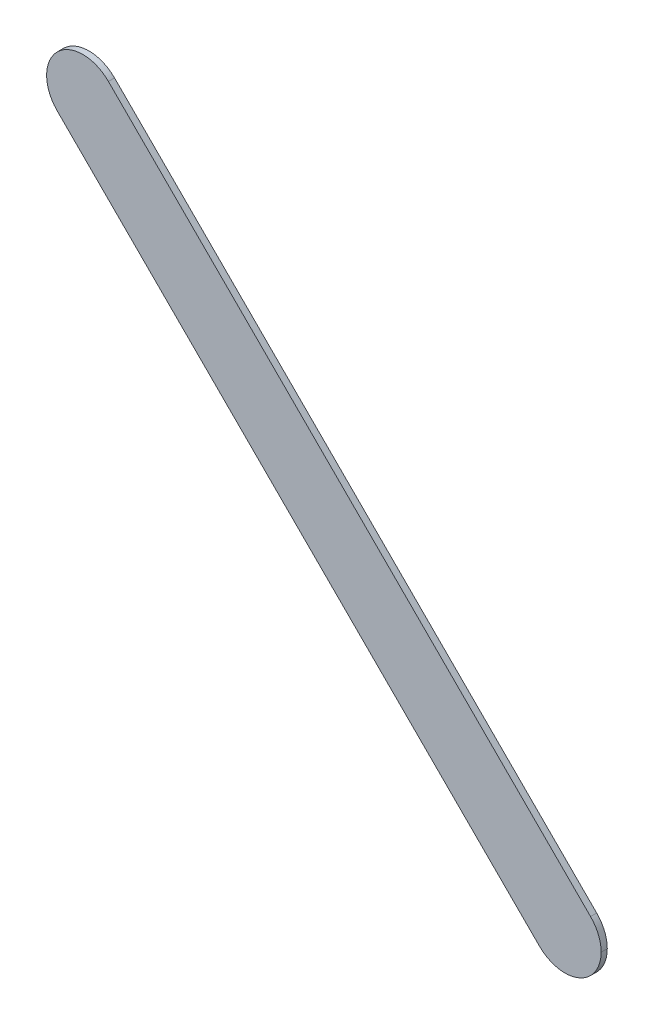
ISO-10303-21;
HEADER;
FILE_DESCRIPTION(('STEP AP214'),'2;1');
FILE_NAME('part.step','',(''),(''),'','','');
FILE_SCHEMA(('AUTOMOTIVE_DESIGN { 1 0 10303 214 1 1 1 1 }'));
ENDSEC;
DATA;
#1=APPLICATION_CONTEXT('core data for automotive mechanical design processes');
#2=APPLICATION_PROTOCOL_DEFINITION('international standard','automotive_design',2000,#1);
#3=PRODUCT_CONTEXT('',#1,'mechanical');
#4=PRODUCT('Part','Part','',(#3));
#5=PRODUCT_RELATED_PRODUCT_CATEGORY('part','',(#4));
#6=PRODUCT_DEFINITION_FORMATION('','',#4);
#7=PRODUCT_DEFINITION_CONTEXT('part definition',#1,'design');
#8=PRODUCT_DEFINITION('design','',#6,#7);
#9=PRODUCT_DEFINITION_SHAPE('','',#8);
#10=(LENGTH_UNIT() NAMED_UNIT(*) SI_UNIT(.MILLI.,.METRE.));
#11=(NAMED_UNIT(*) PLANE_ANGLE_UNIT() SI_UNIT($,.RADIAN.));
#12=(NAMED_UNIT(*) SI_UNIT($,.STERADIAN.) SOLID_ANGLE_UNIT());
#13=UNCERTAINTY_MEASURE_WITH_UNIT(LENGTH_MEASURE(1.E-05),#10,'distance_accuracy_value','');
#14=(GEOMETRIC_REPRESENTATION_CONTEXT(3) GLOBAL_UNCERTAINTY_ASSIGNED_CONTEXT((#13)) GLOBAL_UNIT_ASSIGNED_CONTEXT((#10,
#11,#12)) REPRESENTATION_CONTEXT('',''));
#15=CARTESIAN_POINT('',(0.,0.,0.));
#16=DIRECTION('',(0.,0.,1.));
#17=DIRECTION('',(1.,0.,0.));
#18=AXIS2_PLACEMENT_3D('',#15,#16,#17);
#19=CARTESIAN_POINT('',(20.874999462994,43.162497787694,1.1723000001));
#20=DIRECTION('',(0.,0.,1.));
#21=DIRECTION('',(1.,0.,0.));
#22=AXIS2_PLACEMENT_3D('',#19,#20,#21);
#23=PLANE('',#22);
#24=CARTESIAN_POINT('',(21.375,42.662497558594,1.1723000001));
#25=DIRECTION('',(0.,0.,-1.));
#26=DIRECTION('',(1.,0.,0.));
#27=AXIS2_PLACEMENT_3D('',#24,#25,#26);
#28=CIRCLE('',#27,0.07500062040232);
#29=CARTESIAN_POINT('',(21.428032836914,42.715531616211,1.1723000001));
#30=VERTEX_POINT('',#29);
#31=CARTESIAN_POINT('',(21.450000620402,42.662497558594,1.1723000001));
#32=VERTEX_POINT('',#31);
#33=EDGE_CURVE('E28',#30,#32,#28,.T.);
#34=ORIENTED_EDGE('',*,*,#33,.F.);
#35=DIRECTION('',(-0.707106781186548,0.707106781186548,0.));
#36=VECTOR('',#35,1.);
#37=CARTESIAN_POINT('',(20.428032226563,43.715532226562,1.1723000001));
#38=LINE('',#37,#36);
#39=CARTESIAN_POINT('',(20.428032684326,43.715531768799,1.1723000001));
#40=VERTEX_POINT('',#39);
#41=EDGE_CURVE('E114',#30,#40,#38,.T.);
#42=ORIENTED_EDGE('',*,*,#41,.T.);
#43=CARTESIAN_POINT('',(20.374999389648,43.662497558594,1.1723000001));
#44=DIRECTION('',(0.,0.,1.));
#45=DIRECTION('',(1.,0.,0.));
#46=AXIS2_PLACEMENT_3D('',#43,#44,#45);
#47=CIRCLE('',#46,0.07500105197735);
#48=CARTESIAN_POINT('',(20.321966111155,43.609463332204,1.1723000001));
#49=VERTEX_POINT('',#48);
#50=EDGE_CURVE('E79',#40,#49,#47,.T.);
#51=ORIENTED_EDGE('',*,*,#50,.T.);
#52=DIRECTION('',(0.707107212769916,-0.707106349602916,0.));
#53=VECTOR('',#52,1.);
#54=CARTESIAN_POINT('',(21.321967773438,42.609462890625,1.1723000001));
#55=LINE('',#54,#53);
#56=CARTESIAN_POINT('',(21.32196717927,42.609463484792,1.1723000001));
#57=VERTEX_POINT('',#56);
#58=EDGE_CURVE('E11',#49,#57,#55,.T.);
#59=ORIENTED_EDGE('',*,*,#58,.T.);
#60=CARTESIAN_POINT('',(21.375,42.662497558594,1.1723000001));
#61=DIRECTION('',(0.,0.,-1.));
#62=DIRECTION('',(1.,0.,0.));
#63=AXIS2_PLACEMENT_3D('',#60,#61,#62);
#64=CIRCLE('',#63,0.07500062040232);
#65=EDGE_CURVE('E21',#32,#57,#64,.T.);
#66=ORIENTED_EDGE('',*,*,#65,.F.);
#67=EDGE_LOOP('',(#34,#42,#51,#59,#66));
#68=FACE_BOUND('',#67,.T.);
#69=ADVANCED_FACE('F17',(#68),#23,.T.);
#70=CARTESIAN_POINT('',(21.321967773438,42.609462890625,1.1596000001));
#71=DIRECTION('',(0.707106349602916,0.707107212769916,0.));
#72=DIRECTION('',(0.,0.,-1.));
#73=AXIS2_PLACEMENT_3D('',#70,#71,#72);
#74=PLANE('',#73);
#75=DIRECTION('',(0.,0.,1.));
#76=VECTOR('',#75,1.);
#77=CARTESIAN_POINT('',(20.321966552734,43.609462890625,1.1596000001));
#78=LINE('',#77,#76);
#79=CARTESIAN_POINT('',(20.321966111155,43.609463332204,1.1596000001));
#80=VERTEX_POINT('',#79);
#81=EDGE_CURVE('E93',#80,#49,#78,.T.);
#82=ORIENTED_EDGE('',*,*,#81,.F.);
#83=DIRECTION('',(0.707107212769916,-0.707106349602916,0.));
#84=VECTOR('',#83,1.);
#85=CARTESIAN_POINT('',(20.321966552734,43.609462890625,1.1596000001));
#86=LINE('',#85,#84);
#87=CARTESIAN_POINT('',(21.32196717927,42.609463484792,1.1596000001));
#88=VERTEX_POINT('',#87);
#89=EDGE_CURVE('E91',#80,#88,#86,.T.);
#90=ORIENTED_EDGE('',*,*,#89,.T.);
#91=DIRECTION('',(0.,0.,-1.));
#92=VECTOR('',#91,1.);
#93=CARTESIAN_POINT('',(21.321967773437,42.609462890625,1.1596000001));
#94=LINE('',#93,#92);
#95=EDGE_CURVE('E100',#57,#88,#94,.T.);
#96=ORIENTED_EDGE('',*,*,#95,.F.);
#97=ORIENTED_EDGE('',*,*,#58,.F.);
#98=EDGE_LOOP('',(#82,#90,#96,#97));
#99=FACE_BOUND('',#98,.T.);
#100=ADVANCED_FACE('F132',(#99),#74,.F.);
#101=CARTESIAN_POINT('',(21.375,42.662497558594,1.1596000001));
#102=DIRECTION('',(0.,0.,1.));
#103=DIRECTION('',(1.,0.,0.));
#104=AXIS2_PLACEMENT_3D('',#101,#102,#103);
#105=CYLINDRICAL_SURFACE('',#104,0.07500062040232);
#106=DIRECTION('',(0.,0.,1.));
#107=VECTOR('',#106,1.);
#108=CARTESIAN_POINT('',(21.450000620402,42.662497558594,1.1596000001));
#109=LINE('',#108,#107);
#110=CARTESIAN_POINT('',(21.450000620402,42.662497558594,1.1596000001));
#111=VERTEX_POINT('',#110);
#112=EDGE_CURVE('E123',#111,#32,#109,.T.);
#113=ORIENTED_EDGE('',*,*,#112,.F.);
#114=CARTESIAN_POINT('',(21.375,42.662497558594,1.1596000001));
#115=DIRECTION('',(0.,0.,1.));
#116=DIRECTION('',(1.,0.,0.));
#117=AXIS2_PLACEMENT_3D('',#114,#115,#116);
#118=CIRCLE('',#117,0.07500062040232);
#119=CARTESIAN_POINT('',(21.428032836914,42.715531616211,1.1596000001));
#120=VERTEX_POINT('',#119);
#121=EDGE_CURVE('E99',#111,#120,#118,.T.);
#122=ORIENTED_EDGE('',*,*,#121,.T.);
#123=DIRECTION('',(0.,0.,1.));
#124=VECTOR('',#123,1.);
#125=CARTESIAN_POINT('',(21.428032226563,42.715532226562,1.1596000001));
#126=LINE('',#125,#124);
#127=EDGE_CURVE('E83',#120,#30,#126,.T.);
#128=ORIENTED_EDGE('',*,*,#127,.T.);
#129=ORIENTED_EDGE('',*,*,#33,.T.);
#130=EDGE_LOOP('',(#113,#122,#128,#129));
#131=FACE_BOUND('',#130,.T.);
#132=ADVANCED_FACE('F144',(#131),#105,.T.);
#133=CARTESIAN_POINT('',(20.428032226563,43.715532226562,1.1596000001));
#134=DIRECTION('',(-0.707106781186548,-0.707106781186548,0.));
#135=DIRECTION('',(-0.707106781186548,0.707106781186548,0.));
#136=AXIS2_PLACEMENT_3D('',#133,#134,#135);
#137=PLANE('',#136);
#138=ORIENTED_EDGE('',*,*,#127,.F.);
#139=DIRECTION('',(-0.707106781186548,0.707106781186548,0.));
#140=VECTOR('',#139,1.);
#141=CARTESIAN_POINT('',(21.428032226563,42.715532226562,1.1596000001));
#142=LINE('',#141,#140);
#143=CARTESIAN_POINT('',(20.428032684326,43.715531768799,1.1596000001));
#144=VERTEX_POINT('',#143);
#145=EDGE_CURVE('E89',#120,#144,#142,.T.);
#146=ORIENTED_EDGE('',*,*,#145,.T.);
#147=DIRECTION('',(0.,0.,-1.));
#148=VECTOR('',#147,1.);
#149=CARTESIAN_POINT('',(20.428032226562,43.715532226562,1.1596000001));
#150=LINE('',#149,#148);
#151=EDGE_CURVE('E72',#40,#144,#150,.T.);
#152=ORIENTED_EDGE('',*,*,#151,.F.);
#153=ORIENTED_EDGE('',*,*,#41,.F.);
#154=EDGE_LOOP('',(#138,#146,#152,#153));
#155=FACE_BOUND('',#154,.T.);
#156=ADVANCED_FACE('F95',(#155),#137,.F.);
#157=CARTESIAN_POINT('',(20.374999389648,43.662497558594,1.1596000001));
#158=DIRECTION('',(0.,0.,1.));
#159=DIRECTION('',(1.,0.,0.));
#160=AXIS2_PLACEMENT_3D('',#157,#158,#159);
#161=CYLINDRICAL_SURFACE('',#160,0.07500105197735);
#162=CARTESIAN_POINT('',(20.374999389648,43.662497558594,1.1596000001));
#163=DIRECTION('',(0.,0.,1.));
#164=DIRECTION('',(1.,0.,0.));
#165=AXIS2_PLACEMENT_3D('',#162,#163,#164);
#166=CIRCLE('',#165,0.07500105197735);
#167=EDGE_CURVE('E76',#144,#80,#166,.T.);
#168=ORIENTED_EDGE('',*,*,#167,.T.);
#169=ORIENTED_EDGE('',*,*,#81,.T.);
#170=ORIENTED_EDGE('',*,*,#50,.F.);
#171=ORIENTED_EDGE('',*,*,#151,.T.);
#172=EDGE_LOOP('',(#168,#169,#170,#171));
#173=FACE_BOUND('',#172,.T.);
#174=ADVANCED_FACE('F74',(#173),#161,.T.);
#175=CARTESIAN_POINT('',(20.874999462994,43.162497787694,1.1596000001));
#176=DIRECTION('',(0.,0.,1.));
#177=DIRECTION('',(1.,0.,0.));
#178=AXIS2_PLACEMENT_3D('',#175,#176,#177);
#179=PLANE('',#178);
#180=ORIENTED_EDGE('',*,*,#145,.F.);
#181=ORIENTED_EDGE('',*,*,#121,.F.);
#182=CARTESIAN_POINT('',(21.375,42.662497558594,1.1596000001));
#183=DIRECTION('',(0.,0.,1.));
#184=DIRECTION('',(1.,0.,0.));
#185=AXIS2_PLACEMENT_3D('',#182,#183,#184);
#186=CIRCLE('',#185,0.07500062040232);
#187=EDGE_CURVE('E119',#88,#111,#186,.T.);
#188=ORIENTED_EDGE('',*,*,#187,.F.);
#189=ORIENTED_EDGE('',*,*,#89,.F.);
#190=ORIENTED_EDGE('',*,*,#167,.F.);
#191=EDGE_LOOP('',(#180,#181,#188,#189,#190));
#192=FACE_BOUND('',#191,.T.);
#193=ADVANCED_FACE('F87',(#192),#179,.F.);
#194=CARTESIAN_POINT('',(21.375,42.662497558594,1.1596000001));
#195=DIRECTION('',(0.,0.,1.));
#196=DIRECTION('',(1.,0.,0.));
#197=AXIS2_PLACEMENT_3D('',#194,#195,#196);
#198=CYLINDRICAL_SURFACE('',#197,0.07500062040232);
#199=ORIENTED_EDGE('',*,*,#187,.T.);
#200=ORIENTED_EDGE('',*,*,#112,.T.);
#201=ORIENTED_EDGE('',*,*,#65,.T.);
#202=ORIENTED_EDGE('',*,*,#95,.T.);
#203=EDGE_LOOP('',(#199,#200,#201,#202));
#204=FACE_BOUND('',#203,.T.);
#205=ADVANCED_FACE('F19',(#204),#198,.T.);
#206=CLOSED_SHELL('',(#69,#100,#132,#156,#174,#193,#205));
#207=MANIFOLD_SOLID_BREP('B1',#206);
#208=ADVANCED_BREP_SHAPE_REPRESENTATION('',(#18,#207),#14);
#209=SHAPE_DEFINITION_REPRESENTATION(#9,#208);
ENDSEC;
END-ISO-10303-21;
